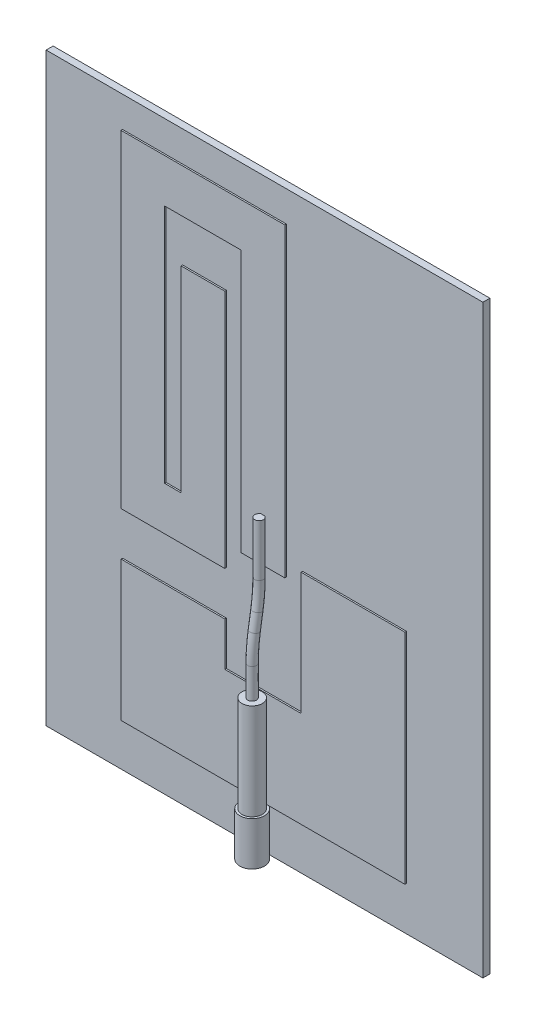
ISO-10303-21;
HEADER;
FILE_DESCRIPTION(('STEP AP214'),'2;1');
FILE_NAME('part.step','',(''),(''),'','','');
FILE_SCHEMA(('AUTOMOTIVE_DESIGN { 1 0 10303 214 1 1 1 1 }'));
ENDSEC;
DATA;
#1=APPLICATION_CONTEXT('core data for automotive mechanical design processes');
#2=APPLICATION_PROTOCOL_DEFINITION('international standard','automotive_design',2000,#1);
#3=PRODUCT_CONTEXT('',#1,'mechanical');
#4=PRODUCT('Part','Part','',(#3));
#5=PRODUCT_RELATED_PRODUCT_CATEGORY('part','',(#4));
#6=PRODUCT_DEFINITION_FORMATION('','',#4);
#7=PRODUCT_DEFINITION_CONTEXT('part definition',#1,'design');
#8=PRODUCT_DEFINITION('design','',#6,#7);
#9=PRODUCT_DEFINITION_SHAPE('','',#8);
#10=(LENGTH_UNIT() NAMED_UNIT(*) SI_UNIT(.MILLI.,.METRE.));
#11=(NAMED_UNIT(*) PLANE_ANGLE_UNIT() SI_UNIT($,.RADIAN.));
#12=(NAMED_UNIT(*) SI_UNIT($,.STERADIAN.) SOLID_ANGLE_UNIT());
#13=UNCERTAINTY_MEASURE_WITH_UNIT(LENGTH_MEASURE(1.E-05),#10,'distance_accuracy_value','');
#14=(GEOMETRIC_REPRESENTATION_CONTEXT(3) GLOBAL_UNCERTAINTY_ASSIGNED_CONTEXT((#13)) GLOBAL_UNIT_ASSIGNED_CONTEXT((#10,
#11,#12)) REPRESENTATION_CONTEXT('',''));
#15=CARTESIAN_POINT('',(0.,0.,0.));
#16=DIRECTION('',(0.,0.,1.));
#17=DIRECTION('',(1.,0.,0.));
#18=AXIS2_PLACEMENT_3D('',#15,#16,#17);
#19=CARTESIAN_POINT('',(0.,0.,0.25));
#20=DIRECTION('',(0.,-1.,0.));
#21=DIRECTION('',(0.,0.,-1.));
#22=AXIS2_PLACEMENT_3D('',#19,#20,#21);
#23=PLANE('',#22);
#24=CARTESIAN_POINT('',(0.,0.,0.25));
#25=DIRECTION('',(0.,-1.,0.));
#26=DIRECTION('',(0.,0.,-1.));
#27=AXIS2_PLACEMENT_3D('',#24,#25,#26);
#28=CIRCLE('',#27,0.2);
#29=CARTESIAN_POINT('',(0.,0.,0.05));
#30=VERTEX_POINT('',#29);
#31=EDGE_CURVE('E60',#30,#30,#28,.T.);
#32=ORIENTED_EDGE('',*,*,#31,.F.);
#33=EDGE_LOOP('',(#32));
#34=FACE_BOUND('',#33,.T.);
#35=ADVANCED_FACE('F54',(#34),#23,.F.);
#36=CARTESIAN_POINT('',(0.,-8.,0.565));
#37=DIRECTION('',(0.,1.,0.));
#38=DIRECTION('',(0.,0.,1.));
#39=AXIS2_PLACEMENT_3D('',#36,#37,#38);
#40=CYLINDRICAL_SURFACE('',#39,0.2);
#41=CARTESIAN_POINT('',(0.,-7.,0.565));
#42=DIRECTION('',(0.,1.,0.));
#43=DIRECTION('',(-1.,0.,0.));
#44=AXIS2_PLACEMENT_3D('',#41,#42,#43);
#45=CIRCLE('',#44,0.2);
#46=CARTESIAN_POINT('',(-0.2,-7.,0.565));
#47=VERTEX_POINT('',#46);
#48=EDGE_CURVE('E12',#47,#47,#45,.T.);
#49=ORIENTED_EDGE('',*,*,#48,.T.);
#50=EDGE_LOOP('',(#49));
#51=FACE_BOUND('',#50,.T.);
#52=CARTESIAN_POINT('',(0.,-5.62614073594746,0.565));
#53=DIRECTION('',(0.,-1.,0.));
#54=DIRECTION('',(0.,0.,-1.));
#55=AXIS2_PLACEMENT_3D('',#52,#53,#54);
#56=CIRCLE('',#55,0.2);
#57=CARTESIAN_POINT('',(0.,-5.62614073594747,0.765));
#58=VERTEX_POINT('',#57);
#59=EDGE_CURVE('E76',#58,#58,#56,.T.);
#60=ORIENTED_EDGE('',*,*,#59,.T.);
#61=EDGE_LOOP('',(#60));
#62=FACE_BOUND('',#61,.T.);
#63=ADVANCED_FACE('F80',(#51,#62),#40,.T.);
#64=CARTESIAN_POINT('',(0.,-5.62614073594744,-7.435));
#65=DIRECTION('',(-1.,0.,0.));
#66=DIRECTION('',(0.,0.,1.));
#67=AXIS2_PLACEMENT_3D('',#64,#65,#66);
#68=TOROIDAL_SURFACE('',#67,8.,0.2);
#69=CARTESIAN_POINT('',(0.,-4.38148380335054,0.46758369902771));
#70=DIRECTION('',(0.,-0.987822962378464,0.155582116574612));
#71=DIRECTION('',(0.,-0.155582116574612,-0.987822962378464));
#72=AXIS2_PLACEMENT_3D('',#69,#70,#71);
#73=CIRCLE('',#72,0.2);
#74=CARTESIAN_POINT('',(0.,-4.35036738003562,0.665148291503404));
#75=VERTEX_POINT('',#74);
#76=EDGE_CURVE('E73',#75,#75,#73,.T.);
#77=CARTESIAN_POINT('',(0.,-5.62614073594744,-7.435));
#78=DIRECTION('',(-1.,0.,0.));
#79=DIRECTION('',(0.,0.,1.));
#80=AXIS2_PLACEMENT_3D('',#77,#78,#79);
#81=CIRCLE('',#80,8.2);
#82=EDGE_CURVE('',#58,#75,#81,.T.);
#83=ORIENTED_EDGE('',*,*,#59,.F.);
#84=ORIENTED_EDGE('',*,*,#76,.T.);
#85=ORIENTED_EDGE('',*,*,#82,.T.);
#86=ORIENTED_EDGE('',*,*,#82,.F.);
#87=EDGE_LOOP('',(#83,#85,#84,#86));
#88=FACE_BOUND('',#87,.T.);
#89=ADVANCED_FACE('F82',(#88),#68,.T.);
#90=CARTESIAN_POINT('',(0.,-4.38148380335054,0.467583699027711));
#91=DIRECTION('',(0.,0.987822962378464,-0.155582116574608));
#92=DIRECTION('',(0.,0.155582116574608,0.987822962378464));
#93=AXIS2_PLACEMENT_3D('',#90,#91,#92);
#94=CYLINDRICAL_SURFACE('',#93,0.2);
#95=CARTESIAN_POINT('',(0.,-3.61851619664946,0.347416300972289));
#96=DIRECTION('',(0.,-0.987822962378464,0.155582116574608));
#97=DIRECTION('',(0.,-0.155582116574608,-0.987822962378464));
#98=AXIS2_PLACEMENT_3D('',#95,#96,#97);
#99=CIRCLE('',#98,0.2);
#100=CARTESIAN_POINT('',(0.,-3.64963261996438,0.149851708496596));
#101=VERTEX_POINT('',#100);
#102=EDGE_CURVE('E68',#101,#101,#99,.T.);
#103=ORIENTED_EDGE('',*,*,#102,.T.);
#104=EDGE_LOOP('',(#103));
#105=FACE_BOUND('',#104,.T.);
#106=ORIENTED_EDGE('',*,*,#76,.F.);
#107=EDGE_LOOP('',(#106));
#108=FACE_BOUND('',#107,.T.);
#109=ADVANCED_FACE('F84',(#105,#108),#94,.T.);
#110=CARTESIAN_POINT('',(0.,-2.37385926405257,8.25));
#111=DIRECTION('',(1.,0.,0.));
#112=DIRECTION('',(0.,0.,-1.));
#113=AXIS2_PLACEMENT_3D('',#110,#111,#112);
#114=TOROIDAL_SURFACE('',#113,8.,0.2);
#115=CARTESIAN_POINT('',(0.,-2.37385926405257,0.250000000000002));
#116=DIRECTION('',(0.,-1.,0.));
#117=DIRECTION('',(0.,0.,-1.));
#118=AXIS2_PLACEMENT_3D('',#115,#116,#117);
#119=CIRCLE('',#118,0.2);
#120=CARTESIAN_POINT('',(0.,-2.37385926405257,0.0500000000000014));
#121=VERTEX_POINT('',#120);
#122=EDGE_CURVE('E64',#121,#121,#119,.T.);
#123=CARTESIAN_POINT('',(0.,-2.37385926405257,8.25));
#124=DIRECTION('',(1.,0.,0.));
#125=DIRECTION('',(0.,0.,-1.));
#126=AXIS2_PLACEMENT_3D('',#123,#124,#125);
#127=CIRCLE('',#126,8.2);
#128=EDGE_CURVE('',#101,#121,#127,.T.);
#129=ORIENTED_EDGE('',*,*,#102,.F.);
#130=ORIENTED_EDGE('',*,*,#122,.T.);
#131=ORIENTED_EDGE('',*,*,#128,.T.);
#132=ORIENTED_EDGE('',*,*,#128,.F.);
#133=EDGE_LOOP('',(#129,#131,#130,#132));
#134=FACE_BOUND('',#133,.T.);
#135=ADVANCED_FACE('F91',(#134),#114,.T.);
#136=CARTESIAN_POINT('',(0.,-2.37385926405257,0.25));
#137=DIRECTION('',(0.,1.,0.));
#138=DIRECTION('',(0.,0.,1.));
#139=AXIS2_PLACEMENT_3D('',#136,#137,#138);
#140=CYLINDRICAL_SURFACE('',#139,0.2);
#141=ORIENTED_EDGE('',*,*,#31,.T.);
#142=EDGE_LOOP('',(#141));
#143=FACE_BOUND('',#142,.T.);
#144=ORIENTED_EDGE('',*,*,#122,.F.);
#145=EDGE_LOOP('',(#144));
#146=FACE_BOUND('',#145,.T.);
#147=ADVANCED_FACE('F95',(#143,#146),#140,.T.);
#148=CARTESIAN_POINT('',(0.,-7.,0.565));
#149=DIRECTION('',(0.,1.,0.));
#150=DIRECTION('',(-1.,0.,0.));
#151=AXIS2_PLACEMENT_3D('',#148,#149,#150);
#152=PLANE('',#151);
#153=ORIENTED_EDGE('',*,*,#48,.F.);
#154=EDGE_LOOP('',(#153));
#155=FACE_BOUND('',#154,.T.);
#156=ADVANCED_FACE('F97',(#155),#152,.F.);
#157=CLOSED_SHELL('',(#35,#63,#89,#109,#135,#147,#156));
#158=MANIFOLD_SOLID_BREP('B2',#157);
#159=CARTESIAN_POINT('',(0.,-11.4,0.565));
#160=DIRECTION('',(0.,-1.,0.));
#161=DIRECTION('',(1.,0.,0.));
#162=AXIS2_PLACEMENT_3D('',#159,#160,#161);
#163=CYLINDRICAL_SURFACE('',#162,0.565);
#164=CARTESIAN_POINT('',(0.,-11.4,0.565));
#165=DIRECTION('',(0.,-1.,0.));
#166=DIRECTION('',(1.,0.,0.));
#167=AXIS2_PLACEMENT_3D('',#164,#165,#166);
#168=CIRCLE('',#167,0.565);
#169=CARTESIAN_POINT('',(0.565000000000002,-11.4,0.565));
#170=VERTEX_POINT('',#169);
#171=EDGE_CURVE('E170',#170,#170,#168,.T.);
#172=ORIENTED_EDGE('',*,*,#171,.T.);
#173=EDGE_LOOP('',(#172));
#174=FACE_BOUND('',#173,.T.);
#175=CARTESIAN_POINT('',(0.,-13.4,0.565));
#176=DIRECTION('',(0.,-1.,0.));
#177=DIRECTION('',(1.,0.,0.));
#178=AXIS2_PLACEMENT_3D('',#175,#176,#177);
#179=CIRCLE('',#178,0.565);
#180=CARTESIAN_POINT('',(0.565000000000002,-13.4,0.565));
#181=VERTEX_POINT('',#180);
#182=EDGE_CURVE('E166',#181,#181,#179,.T.);
#183=ORIENTED_EDGE('',*,*,#182,.F.);
#184=EDGE_LOOP('',(#183));
#185=FACE_BOUND('',#184,.T.);
#186=ADVANCED_FACE('F163',(#174,#185),#163,.T.);
#187=CARTESIAN_POINT('',(0.,-11.4,0.));
#188=DIRECTION('',(0.,-1.,0.));
#189=DIRECTION('',(1.,0.,0.));
#190=AXIS2_PLACEMENT_3D('',#187,#188,#189);
#191=PLANE('',#190);
#192=CARTESIAN_POINT('',(0.,-11.4,0.565));
#193=DIRECTION('',(0.,1.,0.));
#194=DIRECTION('',(-1.,0.,0.));
#195=AXIS2_PLACEMENT_3D('',#192,#193,#194);
#196=CIRCLE('',#195,0.465);
#197=CARTESIAN_POINT('',(-0.464999999999998,-11.4,0.565));
#198=VERTEX_POINT('',#197);
#199=EDGE_CURVE('E53',#198,#198,#196,.T.);
#200=ORIENTED_EDGE('',*,*,#199,.F.);
#201=EDGE_LOOP('',(#200));
#202=FACE_BOUND('',#201,.T.);
#203=ORIENTED_EDGE('',*,*,#171,.F.);
#204=EDGE_LOOP('',(#203));
#205=FACE_BOUND('',#204,.T.);
#206=ADVANCED_FACE('F186',(#202,#205),#191,.F.);
#207=CARTESIAN_POINT('',(0.,-13.4,0.));
#208=DIRECTION('',(0.,-1.,0.));
#209=DIRECTION('',(1.,0.,0.));
#210=AXIS2_PLACEMENT_3D('',#207,#208,#209);
#211=PLANE('',#210);
#212=ORIENTED_EDGE('',*,*,#182,.T.);
#213=EDGE_LOOP('',(#212));
#214=FACE_BOUND('',#213,.T.);
#215=ADVANCED_FACE('F183',(#214),#211,.T.);
#216=CARTESIAN_POINT('',(0.,-7.,0.565));
#217=DIRECTION('',(0.,-1.,0.));
#218=DIRECTION('',(1.,0.,0.));
#219=AXIS2_PLACEMENT_3D('',#216,#217,#218);
#220=CYLINDRICAL_SURFACE('',#219,0.465);
#221=CARTESIAN_POINT('',(0.,-7.,0.565));
#222=DIRECTION('',(0.,1.,0.));
#223=DIRECTION('',(-1.,0.,0.));
#224=AXIS2_PLACEMENT_3D('',#221,#222,#223);
#225=CIRCLE('',#224,0.465);
#226=CARTESIAN_POINT('',(-0.464999999999999,-7.,0.565));
#227=VERTEX_POINT('',#226);
#228=EDGE_CURVE('E176',#227,#227,#225,.T.);
#229=ORIENTED_EDGE('',*,*,#228,.F.);
#230=EDGE_LOOP('',(#229));
#231=FACE_BOUND('',#230,.T.);
#232=ORIENTED_EDGE('',*,*,#199,.T.);
#233=EDGE_LOOP('',(#232));
#234=FACE_BOUND('',#233,.T.);
#235=ADVANCED_FACE('F198',(#231,#234),#220,.T.);
#236=CARTESIAN_POINT('',(0.,-7.,0.565));
#237=DIRECTION('',(0.,1.,0.));
#238=DIRECTION('',(-1.,0.,0.));
#239=AXIS2_PLACEMENT_3D('',#236,#237,#238);
#240=PLANE('',#239);
#241=ORIENTED_EDGE('',*,*,#228,.T.);
#242=EDGE_LOOP('',(#241));
#243=FACE_BOUND('',#242,.T.);
#244=ADVANCED_FACE('F202',(#243),#240,.T.);
#245=CLOSED_SHELL('',(#186,#206,#215,#235,#244));
#246=MANIFOLD_SOLID_BREP('B7',#245);
#247=CARTESIAN_POINT('',(0.,0.,0.));
#248=DIRECTION('',(0.,0.,-1.));
#249=DIRECTION('',(-1.,0.,0.));
#250=AXIS2_PLACEMENT_3D('',#247,#248,#249);
#251=PLANE('',#250);
#252=DIRECTION('',(1.,0.,0.));
#253=VECTOR('',#252,1.);
#254=CARTESIAN_POINT('',(6.5,-11.4,0.));
#255=LINE('',#254,#253);
#256=CARTESIAN_POINT('',(-6.5,-11.4,0.));
#257=VERTEX_POINT('',#256);
#258=CARTESIAN_POINT('',(6.5,-11.4,0.));
#259=VERTEX_POINT('',#258);
#260=EDGE_CURVE('E420',#257,#259,#255,.T.);
#261=ORIENTED_EDGE('',*,*,#260,.F.);
#262=DIRECTION('',(0.,-1.,0.));
#263=VECTOR('',#262,1.);
#264=CARTESIAN_POINT('',(-6.5,-11.4,0.));
#265=LINE('',#264,#263);
#266=CARTESIAN_POINT('',(-6.5,-5.,0.));
#267=VERTEX_POINT('',#266);
#268=EDGE_CURVE('E433',#267,#257,#265,.T.);
#269=ORIENTED_EDGE('',*,*,#268,.F.);
#270=DIRECTION('',(-1.,0.,0.));
#271=VECTOR('',#270,1.);
#272=CARTESIAN_POINT('',(-6.5,-5.,0.));
#273=LINE('',#272,#271);
#274=CARTESIAN_POINT('',(-1.75,-5.,0.));
#275=VERTEX_POINT('',#274);
#276=EDGE_CURVE('E462',#275,#267,#273,.T.);
#277=ORIENTED_EDGE('',*,*,#276,.F.);
#278=DIRECTION('',(0.,1.,0.));
#279=VECTOR('',#278,1.);
#280=CARTESIAN_POINT('',(-1.75,-5.,0.));
#281=LINE('',#280,#279);
#282=CARTESIAN_POINT('',(-1.75,-7.,0.));
#283=VERTEX_POINT('',#282);
#284=EDGE_CURVE('E459',#283,#275,#281,.T.);
#285=ORIENTED_EDGE('',*,*,#284,.F.);
#286=DIRECTION('',(-1.,0.,0.));
#287=VECTOR('',#286,1.);
#288=CARTESIAN_POINT('',(-1.75,-7.,0.));
#289=LINE('',#288,#287);
#290=CARTESIAN_POINT('',(1.75,-7.,0.));
#291=VERTEX_POINT('',#290);
#292=EDGE_CURVE('E456',#291,#283,#289,.T.);
#293=ORIENTED_EDGE('',*,*,#292,.F.);
#294=DIRECTION('',(0.,-1.,0.));
#295=VECTOR('',#294,1.);
#296=CARTESIAN_POINT('',(1.75,-7.,0.));
#297=LINE('',#296,#295);
#298=CARTESIAN_POINT('',(1.75,-1.4,0.));
#299=VERTEX_POINT('',#298);
#300=EDGE_CURVE('E453',#299,#291,#297,.T.);
#301=ORIENTED_EDGE('',*,*,#300,.F.);
#302=DIRECTION('',(-1.,0.,0.));
#303=VECTOR('',#302,1.);
#304=CARTESIAN_POINT('',(1.75,-1.4,0.));
#305=LINE('',#304,#303);
#306=CARTESIAN_POINT('',(6.5,-1.4,0.));
#307=VERTEX_POINT('',#306);
#308=EDGE_CURVE('E450',#307,#299,#305,.T.);
#309=ORIENTED_EDGE('',*,*,#308,.F.);
#310=DIRECTION('',(0.,1.,0.));
#311=VECTOR('',#310,1.);
#312=CARTESIAN_POINT('',(6.5,-1.4,0.));
#313=LINE('',#312,#311);
#314=EDGE_CURVE('E423',#259,#307,#313,.T.);
#315=ORIENTED_EDGE('',*,*,#314,.F.);
#316=EDGE_LOOP('',(#261,#269,#277,#285,#293,#301,#309,#315));
#317=FACE_BOUND('',#316,.T.);
#318=DIRECTION('',(0.,-1.,0.));
#319=VECTOR('',#318,1.);
#320=CARTESIAN_POINT('',(-10.,-13.4,0.));
#321=LINE('',#320,#319);
#322=CARTESIAN_POINT('',(-10.,13.4,0.));
#323=VERTEX_POINT('',#322);
#324=CARTESIAN_POINT('',(-10.,-13.4,0.));
#325=VERTEX_POINT('',#324);
#326=EDGE_CURVE('E502',#323,#325,#321,.T.);
#327=ORIENTED_EDGE('',*,*,#326,.T.);
#328=DIRECTION('',(1.,0.,0.));
#329=VECTOR('',#328,1.);
#330=CARTESIAN_POINT('',(-10.,-13.4,0.));
#331=LINE('',#330,#329);
#332=CARTESIAN_POINT('',(10.,-13.4,0.));
#333=VERTEX_POINT('',#332);
#334=EDGE_CURVE('E505',#325,#333,#331,.T.);
#335=ORIENTED_EDGE('',*,*,#334,.T.);
#336=DIRECTION('',(0.,1.,0.));
#337=VECTOR('',#336,1.);
#338=CARTESIAN_POINT('',(10.,-13.4,0.));
#339=LINE('',#338,#337);
#340=CARTESIAN_POINT('',(10.,13.4,0.));
#341=VERTEX_POINT('',#340);
#342=EDGE_CURVE('E508',#333,#341,#339,.T.);
#343=ORIENTED_EDGE('',*,*,#342,.T.);
#344=DIRECTION('',(-1.,0.,0.));
#345=VECTOR('',#344,1.);
#346=CARTESIAN_POINT('',(-10.,13.4,0.));
#347=LINE('',#346,#345);
#348=EDGE_CURVE('E511',#341,#323,#347,.T.);
#349=ORIENTED_EDGE('',*,*,#348,.T.);
#350=EDGE_LOOP('',(#327,#335,#343,#349));
#351=FACE_BOUND('',#350,.T.);
#352=DIRECTION('',(1.,0.,0.));
#353=VECTOR('',#352,1.);
#354=CARTESIAN_POINT('',(1.,-2.,0.));
#355=LINE('',#354,#353);
#356=CARTESIAN_POINT('',(-1.,-2.,0.));
#357=VERTEX_POINT('',#356);
#358=CARTESIAN_POINT('',(1.,-2.,0.));
#359=VERTEX_POINT('',#358);
#360=EDGE_CURVE('E419',#357,#359,#355,.T.);
#361=ORIENTED_EDGE('',*,*,#360,.F.);
#362=DIRECTION('',(0.,-1.,0.));
#363=VECTOR('',#362,1.);
#364=CARTESIAN_POINT('',(-1.,-2.,0.));
#365=LINE('',#364,#363);
#366=CARTESIAN_POINT('',(-1.,10.,0.));
#367=VERTEX_POINT('',#366);
#368=EDGE_CURVE('E416',#367,#357,#365,.T.);
#369=ORIENTED_EDGE('',*,*,#368,.F.);
#370=DIRECTION('',(1.,0.,0.));
#371=VECTOR('',#370,1.);
#372=CARTESIAN_POINT('',(-1.,10.,0.));
#373=LINE('',#372,#371);
#374=CARTESIAN_POINT('',(-4.5,10.,0.));
#375=VERTEX_POINT('',#374);
#376=EDGE_CURVE('E812',#375,#367,#373,.T.);
#377=ORIENTED_EDGE('',*,*,#376,.F.);
#378=DIRECTION('',(0.,1.,0.));
#379=VECTOR('',#378,1.);
#380=CARTESIAN_POINT('',(-4.5,10.,0.));
#381=LINE('',#380,#379);
#382=CARTESIAN_POINT('',(-4.5,-1.,0.));
#383=VERTEX_POINT('',#382);
#384=EDGE_CURVE('E867',#383,#375,#381,.T.);
#385=ORIENTED_EDGE('',*,*,#384,.F.);
#386=DIRECTION('',(-1.,0.,0.));
#387=VECTOR('',#386,1.);
#388=CARTESIAN_POINT('',(-4.5,-1.,0.));
#389=LINE('',#388,#387);
#390=CARTESIAN_POINT('',(-3.75,-1.,0.));
#391=VERTEX_POINT('',#390);
#392=EDGE_CURVE('E864',#391,#383,#389,.T.);
#393=ORIENTED_EDGE('',*,*,#392,.F.);
#394=DIRECTION('',(0.,-1.,0.));
#395=VECTOR('',#394,1.);
#396=CARTESIAN_POINT('',(-3.75,-1.,0.));
#397=LINE('',#396,#395);
#398=CARTESIAN_POINT('',(-3.75,8.,0.));
#399=VERTEX_POINT('',#398);
#400=EDGE_CURVE('E861',#399,#391,#397,.T.);
#401=ORIENTED_EDGE('',*,*,#400,.F.);
#402=DIRECTION('',(-1.,0.,0.));
#403=VECTOR('',#402,1.);
#404=CARTESIAN_POINT('',(-1.75,8.,0.));
#405=LINE('',#404,#403);
#406=CARTESIAN_POINT('',(-1.75,8.,0.));
#407=VERTEX_POINT('',#406);
#408=EDGE_CURVE('E858',#407,#399,#405,.T.);
#409=ORIENTED_EDGE('',*,*,#408,.F.);
#410=DIRECTION('',(0.,1.,0.));
#411=VECTOR('',#410,1.);
#412=CARTESIAN_POINT('',(-1.75,-3.,0.));
#413=LINE('',#412,#411);
#414=CARTESIAN_POINT('',(-1.75,-3.,0.));
#415=VERTEX_POINT('',#414);
#416=EDGE_CURVE('E855',#415,#407,#413,.T.);
#417=ORIENTED_EDGE('',*,*,#416,.F.);
#418=DIRECTION('',(1.,0.,0.));
#419=VECTOR('',#418,1.);
#420=CARTESIAN_POINT('',(-6.5,-3.,0.));
#421=LINE('',#420,#419);
#422=CARTESIAN_POINT('',(-6.5,-3.,0.));
#423=VERTEX_POINT('',#422);
#424=EDGE_CURVE('E848',#423,#415,#421,.T.);
#425=ORIENTED_EDGE('',*,*,#424,.F.);
#426=DIRECTION('',(0.,-1.,0.));
#427=VECTOR('',#426,1.);
#428=CARTESIAN_POINT('',(-6.5,12.,0.));
#429=LINE('',#428,#427);
#430=CARTESIAN_POINT('',(-6.5,12.,0.));
#431=VERTEX_POINT('',#430);
#432=EDGE_CURVE('E845',#431,#423,#429,.T.);
#433=ORIENTED_EDGE('',*,*,#432,.F.);
#434=DIRECTION('',(-1.,0.,0.));
#435=VECTOR('',#434,1.);
#436=CARTESIAN_POINT('',(1.,12.,0.));
#437=LINE('',#436,#435);
#438=CARTESIAN_POINT('',(1.,12.,0.));
#439=VERTEX_POINT('',#438);
#440=EDGE_CURVE('E259',#439,#431,#437,.T.);
#441=ORIENTED_EDGE('',*,*,#440,.F.);
#442=DIRECTION('',(0.,1.,0.));
#443=VECTOR('',#442,1.);
#444=CARTESIAN_POINT('',(1.,-2.,0.));
#445=LINE('',#444,#443);
#446=EDGE_CURVE('E254',#359,#439,#445,.T.);
#447=ORIENTED_EDGE('',*,*,#446,.F.);
#448=EDGE_LOOP('',(#361,#369,#377,#385,#393,#401,#409,#417,#425,#433,#441,#447));
#449=FACE_BOUND('',#448,.T.);
#450=ADVANCED_FACE('F237',(#317,#351,#449),#251,.F.);
#451=CARTESIAN_POINT('',(-10.,-13.4,-0.17));
#452=DIRECTION('',(-1.,0.,0.));
#453=DIRECTION('',(0.,0.,1.));
#454=AXIS2_PLACEMENT_3D('',#451,#452,#453);
#455=PLANE('',#454);
#456=ORIENTED_EDGE('',*,*,#326,.F.);
#457=DIRECTION('',(0.,0.,1.));
#458=VECTOR('',#457,1.);
#459=CARTESIAN_POINT('',(-10.,13.4,-0.17));
#460=LINE('',#459,#458);
#461=CARTESIAN_POINT('',(-10.,13.4,-0.32));
#462=VERTEX_POINT('',#461);
#463=EDGE_CURVE('E161',#462,#323,#460,.T.);
#464=ORIENTED_EDGE('',*,*,#463,.F.);
#465=DIRECTION('',(0.,1.,0.));
#466=VECTOR('',#465,1.);
#467=CARTESIAN_POINT('',(-10.,0.,-0.32));
#468=LINE('',#467,#466);
#469=CARTESIAN_POINT('',(-10.,-13.4,-0.32));
#470=VERTEX_POINT('',#469);
#471=EDGE_CURVE('E496',#470,#462,#468,.T.);
#472=ORIENTED_EDGE('',*,*,#471,.F.);
#473=DIRECTION('',(0.,0.,1.));
#474=VECTOR('',#473,1.);
#475=CARTESIAN_POINT('',(-10.,-13.4,-0.17));
#476=LINE('',#475,#474);
#477=EDGE_CURVE('E241',#470,#325,#476,.T.);
#478=ORIENTED_EDGE('',*,*,#477,.T.);
#479=EDGE_LOOP('',(#456,#464,#472,#478));
#480=FACE_BOUND('',#479,.T.);
#481=ADVANCED_FACE('F239',(#480),#455,.T.);
#482=CARTESIAN_POINT('',(-10.,13.4,-0.17));
#483=DIRECTION('',(0.,1.,0.));
#484=DIRECTION('',(-1.,0.,0.));
#485=AXIS2_PLACEMENT_3D('',#482,#483,#484);
#486=PLANE('',#485);
#487=ORIENTED_EDGE('',*,*,#348,.F.);
#488=DIRECTION('',(0.,0.,1.));
#489=VECTOR('',#488,1.);
#490=CARTESIAN_POINT('',(10.,13.4,-0.17));
#491=LINE('',#490,#489);
#492=CARTESIAN_POINT('',(10.,13.4,-0.32));
#493=VERTEX_POINT('',#492);
#494=EDGE_CURVE('E246',#493,#341,#491,.T.);
#495=ORIENTED_EDGE('',*,*,#494,.F.);
#496=DIRECTION('',(1.,0.,0.));
#497=VECTOR('',#496,1.);
#498=CARTESIAN_POINT('',(0.,13.4,-0.32));
#499=LINE('',#498,#497);
#500=EDGE_CURVE('E499',#462,#493,#499,.T.);
#501=ORIENTED_EDGE('',*,*,#500,.F.);
#502=ORIENTED_EDGE('',*,*,#463,.T.);
#503=EDGE_LOOP('',(#487,#495,#501,#502));
#504=FACE_BOUND('',#503,.T.);
#505=ADVANCED_FACE('F526',(#504),#486,.T.);
#506=CARTESIAN_POINT('',(10.,-13.4,-0.17));
#507=DIRECTION('',(1.,0.,0.));
#508=DIRECTION('',(0.,0.,-1.));
#509=AXIS2_PLACEMENT_3D('',#506,#507,#508);
#510=PLANE('',#509);
#511=ORIENTED_EDGE('',*,*,#342,.F.);
#512=DIRECTION('',(0.,0.,1.));
#513=VECTOR('',#512,1.);
#514=CARTESIAN_POINT('',(10.,-13.4,-0.17));
#515=LINE('',#514,#513);
#516=CARTESIAN_POINT('',(10.,-13.4,-0.32));
#517=VERTEX_POINT('',#516);
#518=EDGE_CURVE('E514',#517,#333,#515,.T.);
#519=ORIENTED_EDGE('',*,*,#518,.F.);
#520=DIRECTION('',(0.,-1.,0.));
#521=VECTOR('',#520,1.);
#522=CARTESIAN_POINT('',(10.,0.,-0.32));
#523=LINE('',#522,#521);
#524=EDGE_CURVE('E490',#493,#517,#523,.T.);
#525=ORIENTED_EDGE('',*,*,#524,.F.);
#526=ORIENTED_EDGE('',*,*,#494,.T.);
#527=EDGE_LOOP('',(#511,#519,#525,#526));
#528=FACE_BOUND('',#527,.T.);
#529=ADVANCED_FACE('F532',(#528),#510,.T.);
#530=CARTESIAN_POINT('',(-10.,-13.4,-0.17));
#531=DIRECTION('',(0.,-1.,0.));
#532=DIRECTION('',(1.,0.,0.));
#533=AXIS2_PLACEMENT_3D('',#530,#531,#532);
#534=PLANE('',#533);
#535=ORIENTED_EDGE('',*,*,#334,.F.);
#536=ORIENTED_EDGE('',*,*,#477,.F.);
#537=DIRECTION('',(-1.,0.,0.));
#538=VECTOR('',#537,1.);
#539=CARTESIAN_POINT('',(0.,-13.4,-0.32));
#540=LINE('',#539,#538);
#541=EDGE_CURVE('E493',#517,#470,#540,.T.);
#542=ORIENTED_EDGE('',*,*,#541,.F.);
#543=ORIENTED_EDGE('',*,*,#518,.T.);
#544=EDGE_LOOP('',(#535,#536,#542,#543));
#545=FACE_BOUND('',#544,.T.);
#546=ADVANCED_FACE('F522',(#545),#534,.T.);
#547=CARTESIAN_POINT('',(0.,0.,-0.32));
#548=DIRECTION('',(0.,0.,-1.));
#549=DIRECTION('',(-1.,0.,0.));
#550=AXIS2_PLACEMENT_3D('',#547,#548,#549);
#551=PLANE('',#550);
#552=ORIENTED_EDGE('',*,*,#524,.T.);
#553=ORIENTED_EDGE('',*,*,#541,.T.);
#554=ORIENTED_EDGE('',*,*,#471,.T.);
#555=ORIENTED_EDGE('',*,*,#500,.T.);
#556=EDGE_LOOP('',(#552,#553,#554,#555));
#557=FACE_BOUND('',#556,.T.);
#558=ADVANCED_FACE('F529',(#557),#551,.T.);
#559=CARTESIAN_POINT('',(6.5,-11.4,0.07));
#560=DIRECTION('',(0.,1.,0.));
#561=DIRECTION('',(-1.,0.,0.));
#562=AXIS2_PLACEMENT_3D('',#559,#560,#561);
#563=PLANE('',#562);
#564=ORIENTED_EDGE('',*,*,#260,.T.);
#565=DIRECTION('',(0.,0.,-1.));
#566=VECTOR('',#565,1.);
#567=CARTESIAN_POINT('',(6.5,-11.4,0.07));
#568=LINE('',#567,#566);
#569=CARTESIAN_POINT('',(6.5,-11.4,0.07));
#570=VERTEX_POINT('',#569);
#571=EDGE_CURVE('E487',#570,#259,#568,.T.);
#572=ORIENTED_EDGE('',*,*,#571,.F.);
#573=DIRECTION('',(1.,0.,0.));
#574=VECTOR('',#573,1.);
#575=CARTESIAN_POINT('',(6.5,-11.4,0.07));
#576=LINE('',#575,#574);
#577=CARTESIAN_POINT('',(-6.5,-11.4,0.07));
#578=VERTEX_POINT('',#577);
#579=EDGE_CURVE('E429',#578,#570,#576,.T.);
#580=ORIENTED_EDGE('',*,*,#579,.F.);
#581=DIRECTION('',(0.,0.,-1.));
#582=VECTOR('',#581,1.);
#583=CARTESIAN_POINT('',(-6.5,-11.4,0.07));
#584=LINE('',#583,#582);
#585=EDGE_CURVE('E446',#578,#257,#584,.T.);
#586=ORIENTED_EDGE('',*,*,#585,.T.);
#587=EDGE_LOOP('',(#564,#572,#580,#586));
#588=FACE_BOUND('',#587,.T.);
#589=ADVANCED_FACE('F549',(#588),#563,.F.);
#590=CARTESIAN_POINT('',(6.5,-1.4,0.07));
#591=DIRECTION('',(-1.,0.,0.));
#592=DIRECTION('',(0.,-1.,0.));
#593=AXIS2_PLACEMENT_3D('',#590,#591,#592);
#594=PLANE('',#593);
#595=ORIENTED_EDGE('',*,*,#314,.T.);
#596=DIRECTION('',(0.,0.,-1.));
#597=VECTOR('',#596,1.);
#598=CARTESIAN_POINT('',(6.5,-1.4,0.07));
#599=LINE('',#598,#597);
#600=CARTESIAN_POINT('',(6.5,-1.4,0.07));
#601=VERTEX_POINT('',#600);
#602=EDGE_CURVE('E484',#601,#307,#599,.T.);
#603=ORIENTED_EDGE('',*,*,#602,.F.);
#604=DIRECTION('',(0.,1.,0.));
#605=VECTOR('',#604,1.);
#606=CARTESIAN_POINT('',(6.5,-1.4,0.07));
#607=LINE('',#606,#605);
#608=EDGE_CURVE('E432',#570,#601,#607,.T.);
#609=ORIENTED_EDGE('',*,*,#608,.F.);
#610=ORIENTED_EDGE('',*,*,#571,.T.);
#611=EDGE_LOOP('',(#595,#603,#609,#610));
#612=FACE_BOUND('',#611,.T.);
#613=ADVANCED_FACE('F552',(#612),#594,.F.);
#614=CARTESIAN_POINT('',(1.75,-1.4,0.07));
#615=DIRECTION('',(0.,-1.,0.));
#616=DIRECTION('',(1.,0.,0.));
#617=AXIS2_PLACEMENT_3D('',#614,#615,#616);
#618=PLANE('',#617);
#619=ORIENTED_EDGE('',*,*,#308,.T.);
#620=DIRECTION('',(0.,0.,-1.));
#621=VECTOR('',#620,1.);
#622=CARTESIAN_POINT('',(1.75,-1.4,0.07));
#623=LINE('',#622,#621);
#624=CARTESIAN_POINT('',(1.75,-1.4,0.07));
#625=VERTEX_POINT('',#624);
#626=EDGE_CURVE('E481',#625,#299,#623,.T.);
#627=ORIENTED_EDGE('',*,*,#626,.F.);
#628=DIRECTION('',(-1.,0.,0.));
#629=VECTOR('',#628,1.);
#630=CARTESIAN_POINT('',(1.75,-1.4,0.07));
#631=LINE('',#630,#629);
#632=EDGE_CURVE('E435',#601,#625,#631,.T.);
#633=ORIENTED_EDGE('',*,*,#632,.F.);
#634=ORIENTED_EDGE('',*,*,#602,.T.);
#635=EDGE_LOOP('',(#619,#627,#633,#634));
#636=FACE_BOUND('',#635,.T.);
#637=ADVANCED_FACE('F556',(#636),#618,.F.);
#638=CARTESIAN_POINT('',(1.75,-7.,0.07));
#639=DIRECTION('',(1.,0.,0.));
#640=DIRECTION('',(0.,1.,0.));
#641=AXIS2_PLACEMENT_3D('',#638,#639,#640);
#642=PLANE('',#641);
#643=ORIENTED_EDGE('',*,*,#300,.T.);
#644=DIRECTION('',(0.,0.,-1.));
#645=VECTOR('',#644,1.);
#646=CARTESIAN_POINT('',(1.75,-7.,0.07));
#647=LINE('',#646,#645);
#648=CARTESIAN_POINT('',(1.75,-7.,0.07));
#649=VERTEX_POINT('',#648);
#650=EDGE_CURVE('E478',#649,#291,#647,.T.);
#651=ORIENTED_EDGE('',*,*,#650,.F.);
#652=DIRECTION('',(0.,-1.,0.));
#653=VECTOR('',#652,1.);
#654=CARTESIAN_POINT('',(1.75,-7.,0.07));
#655=LINE('',#654,#653);
#656=EDGE_CURVE('E437',#625,#649,#655,.T.);
#657=ORIENTED_EDGE('',*,*,#656,.F.);
#658=ORIENTED_EDGE('',*,*,#626,.T.);
#659=EDGE_LOOP('',(#643,#651,#657,#658));
#660=FACE_BOUND('',#659,.T.);
#661=ADVANCED_FACE('F560',(#660),#642,.F.);
#662=CARTESIAN_POINT('',(-1.75,-7.,0.07));
#663=DIRECTION('',(0.,-1.,0.));
#664=DIRECTION('',(0.,0.,-1.));
#665=AXIS2_PLACEMENT_3D('',#662,#663,#664);
#666=PLANE('',#665);
#667=ORIENTED_EDGE('',*,*,#292,.T.);
#668=DIRECTION('',(0.,0.,-1.));
#669=VECTOR('',#668,1.);
#670=CARTESIAN_POINT('',(-1.75,-7.,0.07));
#671=LINE('',#670,#669);
#672=CARTESIAN_POINT('',(-1.75,-7.,0.07));
#673=VERTEX_POINT('',#672);
#674=EDGE_CURVE('E475',#673,#283,#671,.T.);
#675=ORIENTED_EDGE('',*,*,#674,.F.);
#676=DIRECTION('',(-1.,0.,0.));
#677=VECTOR('',#676,1.);
#678=CARTESIAN_POINT('',(-1.75,-7.,0.07));
#679=LINE('',#678,#677);
#680=EDGE_CURVE('E439',#649,#673,#679,.T.);
#681=ORIENTED_EDGE('',*,*,#680,.F.);
#682=ORIENTED_EDGE('',*,*,#650,.T.);
#683=EDGE_LOOP('',(#667,#675,#681,#682));
#684=FACE_BOUND('',#683,.T.);
#685=ADVANCED_FACE('F564',(#684),#666,.F.);
#686=CARTESIAN_POINT('',(-1.75,-5.,0.07));
#687=DIRECTION('',(-1.,0.,0.));
#688=DIRECTION('',(0.,-1.,0.));
#689=AXIS2_PLACEMENT_3D('',#686,#687,#688);
#690=PLANE('',#689);
#691=ORIENTED_EDGE('',*,*,#284,.T.);
#692=DIRECTION('',(0.,0.,-1.));
#693=VECTOR('',#692,1.);
#694=CARTESIAN_POINT('',(-1.75,-5.,0.07));
#695=LINE('',#694,#693);
#696=CARTESIAN_POINT('',(-1.75,-5.,0.07));
#697=VERTEX_POINT('',#696);
#698=EDGE_CURVE('E472',#697,#275,#695,.T.);
#699=ORIENTED_EDGE('',*,*,#698,.F.);
#700=DIRECTION('',(0.,1.,0.));
#701=VECTOR('',#700,1.);
#702=CARTESIAN_POINT('',(-1.75,-5.,0.07));
#703=LINE('',#702,#701);
#704=EDGE_CURVE('E441',#673,#697,#703,.T.);
#705=ORIENTED_EDGE('',*,*,#704,.F.);
#706=ORIENTED_EDGE('',*,*,#674,.T.);
#707=EDGE_LOOP('',(#691,#699,#705,#706));
#708=FACE_BOUND('',#707,.T.);
#709=ADVANCED_FACE('F568',(#708),#690,.F.);
#710=CARTESIAN_POINT('',(-6.5,-5.,0.07));
#711=DIRECTION('',(0.,-1.,0.));
#712=DIRECTION('',(0.,0.,-1.));
#713=AXIS2_PLACEMENT_3D('',#710,#711,#712);
#714=PLANE('',#713);
#715=ORIENTED_EDGE('',*,*,#276,.T.);
#716=DIRECTION('',(0.,0.,-1.));
#717=VECTOR('',#716,1.);
#718=CARTESIAN_POINT('',(-6.5,-5.,0.07));
#719=LINE('',#718,#717);
#720=CARTESIAN_POINT('',(-6.5,-5.,0.07));
#721=VERTEX_POINT('',#720);
#722=EDGE_CURVE('E469',#721,#267,#719,.T.);
#723=ORIENTED_EDGE('',*,*,#722,.F.);
#724=DIRECTION('',(-1.,0.,0.));
#725=VECTOR('',#724,1.);
#726=CARTESIAN_POINT('',(-6.5,-5.,0.07));
#727=LINE('',#726,#725);
#728=EDGE_CURVE('E443',#697,#721,#727,.T.);
#729=ORIENTED_EDGE('',*,*,#728,.F.);
#730=ORIENTED_EDGE('',*,*,#698,.T.);
#731=EDGE_LOOP('',(#715,#723,#729,#730));
#732=FACE_BOUND('',#731,.T.);
#733=ADVANCED_FACE('F572',(#732),#714,.F.);
#734=CARTESIAN_POINT('',(-6.5,-11.4,0.07));
#735=DIRECTION('',(1.,0.,0.));
#736=DIRECTION('',(0.,0.,-1.));
#737=AXIS2_PLACEMENT_3D('',#734,#735,#736);
#738=PLANE('',#737);
#739=ORIENTED_EDGE('',*,*,#268,.T.);
#740=ORIENTED_EDGE('',*,*,#585,.F.);
#741=DIRECTION('',(0.,-1.,0.));
#742=VECTOR('',#741,1.);
#743=CARTESIAN_POINT('',(-6.5,-11.4,0.07));
#744=LINE('',#743,#742);
#745=EDGE_CURVE('E445',#721,#578,#744,.T.);
#746=ORIENTED_EDGE('',*,*,#745,.F.);
#747=ORIENTED_EDGE('',*,*,#722,.T.);
#748=EDGE_LOOP('',(#739,#740,#746,#747));
#749=FACE_BOUND('',#748,.T.);
#750=ADVANCED_FACE('F576',(#749),#738,.F.);
#751=CARTESIAN_POINT('',(0.,0.,0.07));
#752=DIRECTION('',(0.,0.,-1.));
#753=DIRECTION('',(-1.,0.,0.));
#754=AXIS2_PLACEMENT_3D('',#751,#752,#753);
#755=PLANE('',#754);
#756=ORIENTED_EDGE('',*,*,#579,.T.);
#757=ORIENTED_EDGE('',*,*,#608,.T.);
#758=ORIENTED_EDGE('',*,*,#632,.T.);
#759=ORIENTED_EDGE('',*,*,#656,.T.);
#760=ORIENTED_EDGE('',*,*,#680,.T.);
#761=ORIENTED_EDGE('',*,*,#704,.T.);
#762=ORIENTED_EDGE('',*,*,#728,.T.);
#763=ORIENTED_EDGE('',*,*,#745,.T.);
#764=EDGE_LOOP('',(#756,#757,#758,#759,#760,#761,#762,#763));
#765=FACE_BOUND('',#764,.T.);
#766=ADVANCED_FACE('F580',(#765),#755,.F.);
#767=CARTESIAN_POINT('',(1.,-2.,0.07));
#768=DIRECTION('',(0.,1.,0.));
#769=DIRECTION('',(0.,0.,1.));
#770=AXIS2_PLACEMENT_3D('',#767,#768,#769);
#771=PLANE('',#770);
#772=ORIENTED_EDGE('',*,*,#360,.T.);
#773=DIRECTION('',(0.,0.,-1.));
#774=VECTOR('',#773,1.);
#775=CARTESIAN_POINT('',(1.,-2.,0.07));
#776=LINE('',#775,#774);
#777=CARTESIAN_POINT('',(1.,-2.,0.07));
#778=VERTEX_POINT('',#777);
#779=EDGE_CURVE('E400',#778,#359,#776,.T.);
#780=ORIENTED_EDGE('',*,*,#779,.F.);
#781=DIRECTION('',(1.,0.,0.));
#782=VECTOR('',#781,1.);
#783=CARTESIAN_POINT('',(1.,-2.,0.07));
#784=LINE('',#783,#782);
#785=CARTESIAN_POINT('',(-1.,-2.,0.07));
#786=VERTEX_POINT('',#785);
#787=EDGE_CURVE('E407',#786,#778,#784,.T.);
#788=ORIENTED_EDGE('',*,*,#787,.F.);
#789=DIRECTION('',(0.,0.,-1.));
#790=VECTOR('',#789,1.);
#791=CARTESIAN_POINT('',(-1.,-2.,0.07));
#792=LINE('',#791,#790);
#793=EDGE_CURVE('E808',#786,#357,#792,.T.);
#794=ORIENTED_EDGE('',*,*,#793,.T.);
#795=EDGE_LOOP('',(#772,#780,#788,#794));
#796=FACE_BOUND('',#795,.T.);
#797=ADVANCED_FACE('F418',(#796),#771,.F.);
#798=CARTESIAN_POINT('',(1.,-2.,0.07));
#799=DIRECTION('',(-1.,0.,0.));
#800=DIRECTION('',(0.,0.,1.));
#801=AXIS2_PLACEMENT_3D('',#798,#799,#800);
#802=PLANE('',#801);
#803=ORIENTED_EDGE('',*,*,#446,.T.);
#804=DIRECTION('',(0.,0.,-1.));
#805=VECTOR('',#804,1.);
#806=CARTESIAN_POINT('',(1.,12.,0.07));
#807=LINE('',#806,#805);
#808=CARTESIAN_POINT('',(1.,12.,0.07));
#809=VERTEX_POINT('',#808);
#810=EDGE_CURVE('E403',#809,#439,#807,.T.);
#811=ORIENTED_EDGE('',*,*,#810,.F.);
#812=DIRECTION('',(0.,1.,0.));
#813=VECTOR('',#812,1.);
#814=CARTESIAN_POINT('',(1.,-2.,0.07));
#815=LINE('',#814,#813);
#816=EDGE_CURVE('E396',#778,#809,#815,.T.);
#817=ORIENTED_EDGE('',*,*,#816,.F.);
#818=ORIENTED_EDGE('',*,*,#779,.T.);
#819=EDGE_LOOP('',(#803,#811,#817,#818));
#820=FACE_BOUND('',#819,.T.);
#821=ADVANCED_FACE('F398',(#820),#802,.F.);
#822=CARTESIAN_POINT('',(1.,12.,0.07));
#823=DIRECTION('',(0.,-1.,0.));
#824=DIRECTION('',(0.,0.,-1.));
#825=AXIS2_PLACEMENT_3D('',#822,#823,#824);
#826=PLANE('',#825);
#827=ORIENTED_EDGE('',*,*,#440,.T.);
#828=DIRECTION('',(0.,0.,-1.));
#829=VECTOR('',#828,1.);
#830=CARTESIAN_POINT('',(-6.5,12.,0.07));
#831=LINE('',#830,#829);
#832=CARTESIAN_POINT('',(-6.5,12.,0.07));
#833=VERTEX_POINT('',#832);
#834=EDGE_CURVE('E425',#833,#431,#831,.T.);
#835=ORIENTED_EDGE('',*,*,#834,.F.);
#836=DIRECTION('',(-1.,0.,0.));
#837=VECTOR('',#836,1.);
#838=CARTESIAN_POINT('',(1.,12.,0.07));
#839=LINE('',#838,#837);
#840=EDGE_CURVE('E406',#809,#833,#839,.T.);
#841=ORIENTED_EDGE('',*,*,#840,.F.);
#842=ORIENTED_EDGE('',*,*,#810,.T.);
#843=EDGE_LOOP('',(#827,#835,#841,#842));
#844=FACE_BOUND('',#843,.T.);
#845=ADVANCED_FACE('F589',(#844),#826,.F.);
#846=CARTESIAN_POINT('',(-6.5,12.,0.07));
#847=DIRECTION('',(1.,0.,0.));
#848=DIRECTION('',(0.,0.,-1.));
#849=AXIS2_PLACEMENT_3D('',#846,#847,#848);
#850=PLANE('',#849);
#851=ORIENTED_EDGE('',*,*,#432,.T.);
#852=DIRECTION('',(0.,0.,-1.));
#853=VECTOR('',#852,1.);
#854=CARTESIAN_POINT('',(-6.5,-3.,0.07));
#855=LINE('',#854,#853);
#856=CARTESIAN_POINT('',(-6.5,-3.,0.07));
#857=VERTEX_POINT('',#856);
#858=EDGE_CURVE('E838',#857,#423,#855,.T.);
#859=ORIENTED_EDGE('',*,*,#858,.F.);
#860=DIRECTION('',(0.,-1.,0.));
#861=VECTOR('',#860,1.);
#862=CARTESIAN_POINT('',(-6.5,12.,0.07));
#863=LINE('',#862,#861);
#864=EDGE_CURVE('E846',#833,#857,#863,.T.);
#865=ORIENTED_EDGE('',*,*,#864,.F.);
#866=ORIENTED_EDGE('',*,*,#834,.T.);
#867=EDGE_LOOP('',(#851,#859,#865,#866));
#868=FACE_BOUND('',#867,.T.);
#869=ADVANCED_FACE('F592',(#868),#850,.F.);
#870=CARTESIAN_POINT('',(-6.5,-3.,0.07));
#871=DIRECTION('',(0.,1.,0.));
#872=DIRECTION('',(0.,0.,1.));
#873=AXIS2_PLACEMENT_3D('',#870,#871,#872);
#874=PLANE('',#873);
#875=ORIENTED_EDGE('',*,*,#424,.T.);
#876=DIRECTION('',(0.,0.,-1.));
#877=VECTOR('',#876,1.);
#878=CARTESIAN_POINT('',(-1.75,-3.,0.07));
#879=LINE('',#878,#877);
#880=CARTESIAN_POINT('',(-1.75,-3.,0.07));
#881=VERTEX_POINT('',#880);
#882=EDGE_CURVE('E835',#881,#415,#879,.T.);
#883=ORIENTED_EDGE('',*,*,#882,.F.);
#884=DIRECTION('',(1.,0.,0.));
#885=VECTOR('',#884,1.);
#886=CARTESIAN_POINT('',(-6.5,-3.,0.07));
#887=LINE('',#886,#885);
#888=EDGE_CURVE('E887',#857,#881,#887,.T.);
#889=ORIENTED_EDGE('',*,*,#888,.F.);
#890=ORIENTED_EDGE('',*,*,#858,.T.);
#891=EDGE_LOOP('',(#875,#883,#889,#890));
#892=FACE_BOUND('',#891,.T.);
#893=ADVANCED_FACE('F596',(#892),#874,.F.);
#894=CARTESIAN_POINT('',(-1.75,-3.,0.07));
#895=DIRECTION('',(-1.,0.,0.));
#896=DIRECTION('',(0.,0.,1.));
#897=AXIS2_PLACEMENT_3D('',#894,#895,#896);
#898=PLANE('',#897);
#899=ORIENTED_EDGE('',*,*,#416,.T.);
#900=DIRECTION('',(0.,0.,-1.));
#901=VECTOR('',#900,1.);
#902=CARTESIAN_POINT('',(-1.75,8.,0.07));
#903=LINE('',#902,#901);
#904=CARTESIAN_POINT('',(-1.75,8.,0.07));
#905=VERTEX_POINT('',#904);
#906=EDGE_CURVE('E832',#905,#407,#903,.T.);
#907=ORIENTED_EDGE('',*,*,#906,.F.);
#908=DIRECTION('',(0.,1.,0.));
#909=VECTOR('',#908,1.);
#910=CARTESIAN_POINT('',(-1.75,-3.,0.07));
#911=LINE('',#910,#909);
#912=EDGE_CURVE('E885',#881,#905,#911,.T.);
#913=ORIENTED_EDGE('',*,*,#912,.F.);
#914=ORIENTED_EDGE('',*,*,#882,.T.);
#915=EDGE_LOOP('',(#899,#907,#913,#914));
#916=FACE_BOUND('',#915,.T.);
#917=ADVANCED_FACE('F600',(#916),#898,.F.);
#918=CARTESIAN_POINT('',(-1.75,8.,0.07));
#919=DIRECTION('',(0.,-1.,0.));
#920=DIRECTION('',(0.,0.,-1.));
#921=AXIS2_PLACEMENT_3D('',#918,#919,#920);
#922=PLANE('',#921);
#923=ORIENTED_EDGE('',*,*,#408,.T.);
#924=DIRECTION('',(0.,0.,-1.));
#925=VECTOR('',#924,1.);
#926=CARTESIAN_POINT('',(-3.75,8.,0.07));
#927=LINE('',#926,#925);
#928=CARTESIAN_POINT('',(-3.75,8.,0.07));
#929=VERTEX_POINT('',#928);
#930=EDGE_CURVE('E829',#929,#399,#927,.T.);
#931=ORIENTED_EDGE('',*,*,#930,.F.);
#932=DIRECTION('',(-1.,0.,0.));
#933=VECTOR('',#932,1.);
#934=CARTESIAN_POINT('',(-1.75,8.,0.07));
#935=LINE('',#934,#933);
#936=EDGE_CURVE('E881',#905,#929,#935,.T.);
#937=ORIENTED_EDGE('',*,*,#936,.F.);
#938=ORIENTED_EDGE('',*,*,#906,.T.);
#939=EDGE_LOOP('',(#923,#931,#937,#938));
#940=FACE_BOUND('',#939,.T.);
#941=ADVANCED_FACE('F604',(#940),#922,.F.);
#942=CARTESIAN_POINT('',(-3.75,-1.,0.07));
#943=DIRECTION('',(1.,0.,0.));
#944=DIRECTION('',(0.,0.,-1.));
#945=AXIS2_PLACEMENT_3D('',#942,#943,#944);
#946=PLANE('',#945);
#947=ORIENTED_EDGE('',*,*,#400,.T.);
#948=DIRECTION('',(0.,0.,-1.));
#949=VECTOR('',#948,1.);
#950=CARTESIAN_POINT('',(-3.75,-1.,0.07));
#951=LINE('',#950,#949);
#952=CARTESIAN_POINT('',(-3.75,-1.,0.07));
#953=VERTEX_POINT('',#952);
#954=EDGE_CURVE('E826',#953,#391,#951,.T.);
#955=ORIENTED_EDGE('',*,*,#954,.F.);
#956=DIRECTION('',(0.,-1.,0.));
#957=VECTOR('',#956,1.);
#958=CARTESIAN_POINT('',(-3.75,-1.,0.07));
#959=LINE('',#958,#957);
#960=EDGE_CURVE('E879',#929,#953,#959,.T.);
#961=ORIENTED_EDGE('',*,*,#960,.F.);
#962=ORIENTED_EDGE('',*,*,#930,.T.);
#963=EDGE_LOOP('',(#947,#955,#961,#962));
#964=FACE_BOUND('',#963,.T.);
#965=ADVANCED_FACE('F608',(#964),#946,.F.);
#966=CARTESIAN_POINT('',(-4.5,-1.,0.07));
#967=DIRECTION('',(0.,-1.,0.));
#968=DIRECTION('',(0.,0.,-1.));
#969=AXIS2_PLACEMENT_3D('',#966,#967,#968);
#970=PLANE('',#969);
#971=ORIENTED_EDGE('',*,*,#392,.T.);
#972=DIRECTION('',(0.,0.,-1.));
#973=VECTOR('',#972,1.);
#974=CARTESIAN_POINT('',(-4.5,-1.,0.07));
#975=LINE('',#974,#973);
#976=CARTESIAN_POINT('',(-4.5,-1.,0.07));
#977=VERTEX_POINT('',#976);
#978=EDGE_CURVE('E823',#977,#383,#975,.T.);
#979=ORIENTED_EDGE('',*,*,#978,.F.);
#980=DIRECTION('',(-1.,0.,0.));
#981=VECTOR('',#980,1.);
#982=CARTESIAN_POINT('',(-4.5,-1.,0.07));
#983=LINE('',#982,#981);
#984=EDGE_CURVE('E875',#953,#977,#983,.T.);
#985=ORIENTED_EDGE('',*,*,#984,.F.);
#986=ORIENTED_EDGE('',*,*,#954,.T.);
#987=EDGE_LOOP('',(#971,#979,#985,#986));
#988=FACE_BOUND('',#987,.T.);
#989=ADVANCED_FACE('F612',(#988),#970,.F.);
#990=CARTESIAN_POINT('',(-4.5,10.,0.07));
#991=DIRECTION('',(-1.,0.,0.));
#992=DIRECTION('',(0.,0.,1.));
#993=AXIS2_PLACEMENT_3D('',#990,#991,#992);
#994=PLANE('',#993);
#995=ORIENTED_EDGE('',*,*,#384,.T.);
#996=DIRECTION('',(0.,0.,-1.));
#997=VECTOR('',#996,1.);
#998=CARTESIAN_POINT('',(-4.5,10.,0.07));
#999=LINE('',#998,#997);
#1000=CARTESIAN_POINT('',(-4.5,10.,0.07));
#1001=VERTEX_POINT('',#1000);
#1002=EDGE_CURVE('E815',#1001,#375,#999,.T.);
#1003=ORIENTED_EDGE('',*,*,#1002,.F.);
#1004=DIRECTION('',(0.,1.,0.));
#1005=VECTOR('',#1004,1.);
#1006=CARTESIAN_POINT('',(-4.5,10.,0.07));
#1007=LINE('',#1006,#1005);
#1008=EDGE_CURVE('E873',#977,#1001,#1007,.T.);
#1009=ORIENTED_EDGE('',*,*,#1008,.F.);
#1010=ORIENTED_EDGE('',*,*,#978,.T.);
#1011=EDGE_LOOP('',(#995,#1003,#1009,#1010));
#1012=FACE_BOUND('',#1011,.T.);
#1013=ADVANCED_FACE('F616',(#1012),#994,.F.);
#1014=CARTESIAN_POINT('',(-1.,10.,0.07));
#1015=DIRECTION('',(0.,1.,0.));
#1016=DIRECTION('',(0.,0.,1.));
#1017=AXIS2_PLACEMENT_3D('',#1014,#1015,#1016);
#1018=PLANE('',#1017);
#1019=ORIENTED_EDGE('',*,*,#376,.T.);
#1020=DIRECTION('',(0.,0.,-1.));
#1021=VECTOR('',#1020,1.);
#1022=CARTESIAN_POINT('',(-1.,10.,0.07));
#1023=LINE('',#1022,#1021);
#1024=CARTESIAN_POINT('',(-1.,10.,0.07));
#1025=VERTEX_POINT('',#1024);
#1026=EDGE_CURVE('E810',#1025,#367,#1023,.T.);
#1027=ORIENTED_EDGE('',*,*,#1026,.F.);
#1028=DIRECTION('',(1.,0.,0.));
#1029=VECTOR('',#1028,1.);
#1030=CARTESIAN_POINT('',(-1.,10.,0.07));
#1031=LINE('',#1030,#1029);
#1032=EDGE_CURVE('E817',#1001,#1025,#1031,.T.);
#1033=ORIENTED_EDGE('',*,*,#1032,.F.);
#1034=ORIENTED_EDGE('',*,*,#1002,.T.);
#1035=EDGE_LOOP('',(#1019,#1027,#1033,#1034));
#1036=FACE_BOUND('',#1035,.T.);
#1037=ADVANCED_FACE('F620',(#1036),#1018,.F.);
#1038=CARTESIAN_POINT('',(-1.,-2.,0.07));
#1039=DIRECTION('',(1.,0.,0.));
#1040=DIRECTION('',(0.,0.,-1.));
#1041=AXIS2_PLACEMENT_3D('',#1038,#1039,#1040);
#1042=PLANE('',#1041);
#1043=ORIENTED_EDGE('',*,*,#368,.T.);
#1044=ORIENTED_EDGE('',*,*,#793,.F.);
#1045=DIRECTION('',(0.,-1.,0.));
#1046=VECTOR('',#1045,1.);
#1047=CARTESIAN_POINT('',(-1.,-2.,0.07));
#1048=LINE('',#1047,#1046);
#1049=EDGE_CURVE('E412',#1025,#786,#1048,.T.);
#1050=ORIENTED_EDGE('',*,*,#1049,.F.);
#1051=ORIENTED_EDGE('',*,*,#1026,.T.);
#1052=EDGE_LOOP('',(#1043,#1044,#1050,#1051));
#1053=FACE_BOUND('',#1052,.T.);
#1054=ADVANCED_FACE('F624',(#1053),#1042,.F.);
#1055=CARTESIAN_POINT('',(0.,0.,0.07));
#1056=DIRECTION('',(0.,0.,-1.));
#1057=DIRECTION('',(-1.,0.,0.));
#1058=AXIS2_PLACEMENT_3D('',#1055,#1056,#1057);
#1059=PLANE('',#1058);
#1060=ORIENTED_EDGE('',*,*,#787,.T.);
#1061=ORIENTED_EDGE('',*,*,#816,.T.);
#1062=ORIENTED_EDGE('',*,*,#840,.T.);
#1063=ORIENTED_EDGE('',*,*,#864,.T.);
#1064=ORIENTED_EDGE('',*,*,#888,.T.);
#1065=ORIENTED_EDGE('',*,*,#912,.T.);
#1066=ORIENTED_EDGE('',*,*,#936,.T.);
#1067=ORIENTED_EDGE('',*,*,#960,.T.);
#1068=ORIENTED_EDGE('',*,*,#984,.T.);
#1069=ORIENTED_EDGE('',*,*,#1008,.T.);
#1070=ORIENTED_EDGE('',*,*,#1032,.T.);
#1071=ORIENTED_EDGE('',*,*,#1049,.T.);
#1072=EDGE_LOOP('',(#1060,#1061,#1062,#1063,#1064,#1065,#1066,#1067,#1068,#1069,#1070,#1071));
#1073=FACE_BOUND('',#1072,.T.);
#1074=ADVANCED_FACE('F410',(#1073),#1059,.F.);
#1075=CLOSED_SHELL('',(#450,#481,#505,#529,#546,#558,#589,#613,#637,#661,#685,#709,#733,#750,
#766,#797,#821,#845,#869,#893,#917,#941,#965,#989,#1013,#1037,#1054,#1074));
#1076=MANIFOLD_SOLID_BREP('B48',#1075);
#1077=ADVANCED_BREP_SHAPE_REPRESENTATION('',(#18,#158,#246,#1076),#14);
#1078=SHAPE_DEFINITION_REPRESENTATION(#9,#1077);
ENDSEC;
END-ISO-10303-21;
